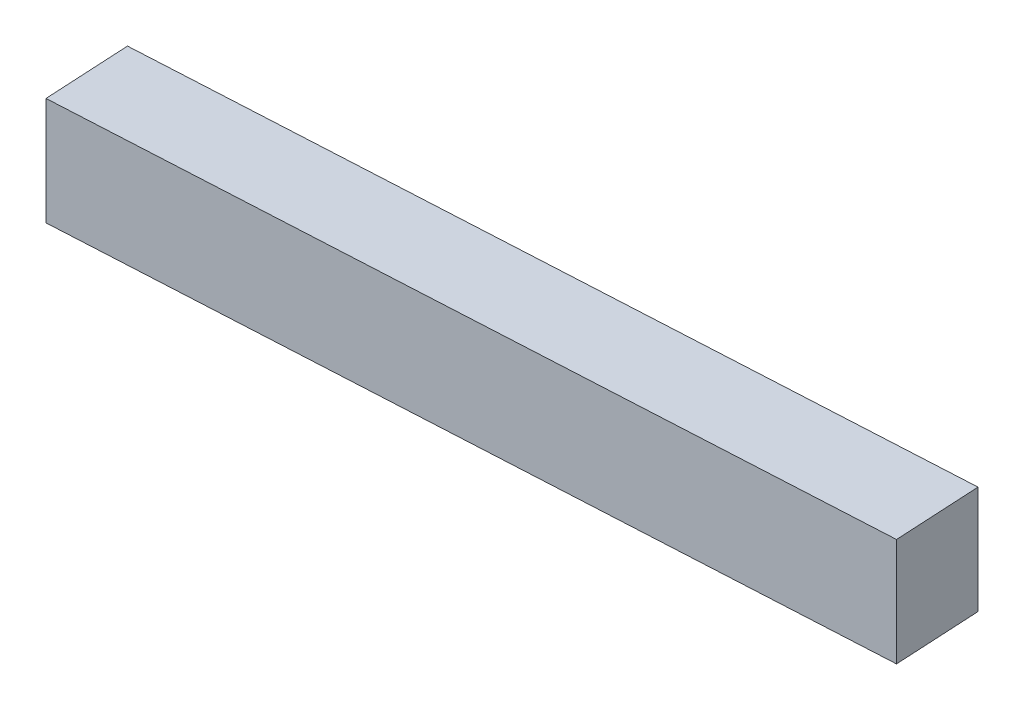
ISO-10303-21;
HEADER;
FILE_DESCRIPTION(('STEP AP214'),'2;1');
FILE_NAME('part.step','',(''),(''),'','','');
FILE_SCHEMA(('AUTOMOTIVE_DESIGN { 1 0 10303 214 1 1 1 1 }'));
ENDSEC;
DATA;
#1=APPLICATION_CONTEXT('core data for automotive mechanical design processes');
#2=APPLICATION_PROTOCOL_DEFINITION('international standard','automotive_design',2000,#1);
#3=PRODUCT_CONTEXT('',#1,'mechanical');
#4=PRODUCT('Part','Part','',(#3));
#5=PRODUCT_RELATED_PRODUCT_CATEGORY('part','',(#4));
#6=PRODUCT_DEFINITION_FORMATION('','',#4);
#7=PRODUCT_DEFINITION_CONTEXT('part definition',#1,'design');
#8=PRODUCT_DEFINITION('design','',#6,#7);
#9=PRODUCT_DEFINITION_SHAPE('','',#8);
#10=(LENGTH_UNIT() NAMED_UNIT(*) SI_UNIT(.MILLI.,.METRE.));
#11=(NAMED_UNIT(*) PLANE_ANGLE_UNIT() SI_UNIT($,.RADIAN.));
#12=(NAMED_UNIT(*) SI_UNIT($,.STERADIAN.) SOLID_ANGLE_UNIT());
#13=UNCERTAINTY_MEASURE_WITH_UNIT(LENGTH_MEASURE(1.E-05),#10,'distance_accuracy_value','');
#14=(GEOMETRIC_REPRESENTATION_CONTEXT(3) GLOBAL_UNCERTAINTY_ASSIGNED_CONTEXT((#13)) GLOBAL_UNIT_ASSIGNED_CONTEXT((#10,
#11,#12)) REPRESENTATION_CONTEXT('',''));
#15=CARTESIAN_POINT('',(0.,0.,0.));
#16=DIRECTION('',(0.,0.,1.));
#17=DIRECTION('',(1.,0.,0.));
#18=AXIS2_PLACEMENT_3D('',#15,#16,#17);
#19=CARTESIAN_POINT('',(-17.9653066454331,7.874,1.06508040233174));
#20=DIRECTION('',(-0.0535792106635244,0.,-0.99856360247341));
#21=DIRECTION('',(-0.99856360247341,0.,0.0535792106635244));
#22=AXIS2_PLACEMENT_3D('',#19,#20,#21);
#23=PLANE('',#22);
#24=DIRECTION('',(0.,1.,0.));
#25=VECTOR('',#24,1.);
#26=CARTESIAN_POINT('',(-17.9653066454331,7.874,1.06508040233174));
#27=LINE('',#26,#25);
#28=CARTESIAN_POINT('',(-17.9653066454331,7.62,1.06508040233174));
#29=VERTEX_POINT('',#28);
#30=CARTESIAN_POINT('',(-17.9653066454331,7.874,1.06508040233174));
#31=VERTEX_POINT('',#30);
#32=EDGE_CURVE('E20',#29,#31,#27,.T.);
#33=ORIENTED_EDGE('',*,*,#32,.T.);
#34=DIRECTION('',(-0.99856360247341,0.,0.0535792106635236));
#35=VECTOR('',#34,1.);
#36=CARTESIAN_POINT('',(-17.9653066454331,7.874,1.06508040233174));
#37=LINE('',#36,#35);
#38=CARTESIAN_POINT('',(-19.8675703081449,7.874,1.16714879864575));
#39=VERTEX_POINT('',#38);
#40=EDGE_CURVE('E55',#31,#39,#37,.T.);
#41=ORIENTED_EDGE('',*,*,#40,.T.);
#42=DIRECTION('',(0.,1.,0.));
#43=VECTOR('',#42,1.);
#44=CARTESIAN_POINT('',(-19.8675703081449,7.874,1.16714879864575));
#45=LINE('',#44,#43);
#46=CARTESIAN_POINT('',(-19.8675703081449,7.62,1.16714879864575));
#47=VERTEX_POINT('',#46);
#48=EDGE_CURVE('E76',#39,#47,#45,.F.);
#49=ORIENTED_EDGE('',*,*,#48,.T.);
#50=DIRECTION('',(-0.99856360247341,0.,0.0535792106635236));
#51=VECTOR('',#50,1.);
#52=CARTESIAN_POINT('',(-17.9653066454331,7.62,1.06508040233174));
#53=LINE('',#52,#51);
#54=EDGE_CURVE('E58',#29,#47,#53,.T.);
#55=ORIENTED_EDGE('',*,*,#54,.F.);
#56=EDGE_LOOP('',(#33,#41,#49,#55));
#57=FACE_BOUND('',#56,.T.);
#58=ADVANCED_FACE('F17',(#57),#23,.F.);
#59=CARTESIAN_POINT('',(-17.9653066454331,7.874,1.06508040233174));
#60=DIRECTION('',(-0.998563602473408,0.,0.0535792106635583));
#61=DIRECTION('',(0.0535792106635583,0.,0.998563602473408));
#62=AXIS2_PLACEMENT_3D('',#59,#60,#61);
#63=PLANE('',#62);
#64=DIRECTION('',(0.,1.,0.));
#65=VECTOR('',#64,1.);
#66=CARTESIAN_POINT('',(-17.9761939410399,7.874,0.862172278309139));
#67=LINE('',#66,#65);
#68=CARTESIAN_POINT('',(-17.9761939410399,7.62,0.86217227830914));
#69=VERTEX_POINT('',#68);
#70=CARTESIAN_POINT('',(-17.9761939410399,7.874,0.86217227830914));
#71=VERTEX_POINT('',#70);
#72=EDGE_CURVE('E73',#69,#71,#67,.T.);
#73=ORIENTED_EDGE('',*,*,#72,.T.);
#74=DIRECTION('',(0.0535792106633878,0.,0.998563602473417));
#75=VECTOR('',#74,1.);
#76=CARTESIAN_POINT('',(-17.9761939410399,7.874,0.862172278309139));
#77=LINE('',#76,#75);
#78=EDGE_CURVE('E63',#71,#31,#77,.T.);
#79=ORIENTED_EDGE('',*,*,#78,.T.);
#80=ORIENTED_EDGE('',*,*,#32,.F.);
#81=DIRECTION('',(0.0535792106633878,0.,0.998563602473417));
#82=VECTOR('',#81,1.);
#83=CARTESIAN_POINT('',(-17.9761939410399,7.62,0.862172278309139));
#84=LINE('',#83,#82);
#85=EDGE_CURVE('E80',#69,#29,#84,.T.);
#86=ORIENTED_EDGE('',*,*,#85,.F.);
#87=EDGE_LOOP('',(#73,#79,#80,#86));
#88=FACE_BOUND('',#87,.T.);
#89=ADVANCED_FACE('F72',(#88),#63,.F.);
#90=CARTESIAN_POINT('',(-17.9653066454331,7.874,1.06508040233174));
#91=DIRECTION('',(0.,-1.,0.));
#92=DIRECTION('',(0.,0.,-1.));
#93=AXIS2_PLACEMENT_3D('',#90,#91,#92);
#94=PLANE('',#93);
#95=ORIENTED_EDGE('',*,*,#78,.F.);
#96=DIRECTION('',(0.99856360247341,0.,-0.0535792106635253));
#97=VECTOR('',#96,1.);
#98=CARTESIAN_POINT('',(-17.9761939410399,7.874,0.862172278309139));
#99=LINE('',#98,#97);
#100=CARTESIAN_POINT('',(-19.8784576040606,7.874,0.964240674639728));
#101=VERTEX_POINT('',#100);
#102=EDGE_CURVE('E83',#71,#101,#99,.F.);
#103=ORIENTED_EDGE('',*,*,#102,.T.);
#104=DIRECTION('',(-0.0535792121836785,0.,-0.998563602391844));
#105=VECTOR('',#104,1.);
#106=CARTESIAN_POINT('',(-19.8675703081449,7.874,1.16714879864575));
#107=LINE('',#106,#105);
#108=EDGE_CURVE('E69',#101,#39,#107,.F.);
#109=ORIENTED_EDGE('',*,*,#108,.T.);
#110=ORIENTED_EDGE('',*,*,#40,.F.);
#111=EDGE_LOOP('',(#95,#103,#109,#110));
#112=FACE_BOUND('',#111,.T.);
#113=ADVANCED_FACE('F66',(#112),#94,.F.);
#114=CARTESIAN_POINT('',(-19.8675703081449,7.874,1.16714879864575));
#115=DIRECTION('',(0.998563602391844,0.,-0.0535792121836785));
#116=DIRECTION('',(-0.0535792121836785,0.,-0.998563602391844));
#117=AXIS2_PLACEMENT_3D('',#114,#115,#116);
#118=PLANE('',#117);
#119=ORIENTED_EDGE('',*,*,#48,.F.);
#120=ORIENTED_EDGE('',*,*,#108,.F.);
#121=DIRECTION('',(0.,1.,0.));
#122=VECTOR('',#121,1.);
#123=CARTESIAN_POINT('',(-19.8784576040606,7.874,0.964240674639727));
#124=LINE('',#123,#122);
#125=CARTESIAN_POINT('',(-19.8784576040606,7.62,0.964240674639728));
#126=VERTEX_POINT('',#125);
#127=EDGE_CURVE('E26',#101,#126,#124,.F.);
#128=ORIENTED_EDGE('',*,*,#127,.T.);
#129=DIRECTION('',(-0.05357921218356,0.,-0.99856360239185));
#130=VECTOR('',#129,1.);
#131=CARTESIAN_POINT('',(-19.8675703081449,7.62,1.16714879864575));
#132=LINE('',#131,#130);
#133=EDGE_CURVE('E34',#47,#126,#132,.T.);
#134=ORIENTED_EDGE('',*,*,#133,.F.);
#135=EDGE_LOOP('',(#119,#120,#128,#134));
#136=FACE_BOUND('',#135,.T.);
#137=ADVANCED_FACE('F88',(#136),#118,.F.);
#138=CARTESIAN_POINT('',(-17.9653066454331,7.62,1.06508040233174));
#139=DIRECTION('',(0.,-1.,0.));
#140=DIRECTION('',(0.,0.,-1.));
#141=AXIS2_PLACEMENT_3D('',#138,#139,#140);
#142=PLANE('',#141);
#143=DIRECTION('',(0.99856360247341,0.,-0.0535792106635253));
#144=VECTOR('',#143,1.);
#145=CARTESIAN_POINT('',(-17.9761939410399,7.62,0.862172278309139));
#146=LINE('',#145,#144);
#147=EDGE_CURVE('E11',#126,#69,#146,.T.);
#148=ORIENTED_EDGE('',*,*,#147,.T.);
#149=ORIENTED_EDGE('',*,*,#85,.T.);
#150=ORIENTED_EDGE('',*,*,#54,.T.);
#151=ORIENTED_EDGE('',*,*,#133,.T.);
#152=EDGE_LOOP('',(#148,#149,#150,#151));
#153=FACE_BOUND('',#152,.T.);
#154=ADVANCED_FACE('F91',(#153),#142,.T.);
#155=CARTESIAN_POINT('',(-17.9761939410399,7.874,0.862172278309139));
#156=DIRECTION('',(0.0535792106635253,0.,0.99856360247341));
#157=DIRECTION('',(0.99856360247341,0.,-0.0535792106635253));
#158=AXIS2_PLACEMENT_3D('',#155,#156,#157);
#159=PLANE('',#158);
#160=ORIENTED_EDGE('',*,*,#127,.F.);
#161=ORIENTED_EDGE('',*,*,#102,.F.);
#162=ORIENTED_EDGE('',*,*,#72,.F.);
#163=ORIENTED_EDGE('',*,*,#147,.F.);
#164=EDGE_LOOP('',(#160,#161,#162,#163));
#165=FACE_BOUND('',#164,.T.);
#166=ADVANCED_FACE('F90',(#165),#159,.F.);
#167=CLOSED_SHELL('',(#58,#89,#113,#137,#154,#166));
#168=MANIFOLD_SOLID_BREP('B1',#167);
#169=ADVANCED_BREP_SHAPE_REPRESENTATION('',(#18,#168),#14);
#170=SHAPE_DEFINITION_REPRESENTATION(#9,#169);
ENDSEC;
END-ISO-10303-21;
